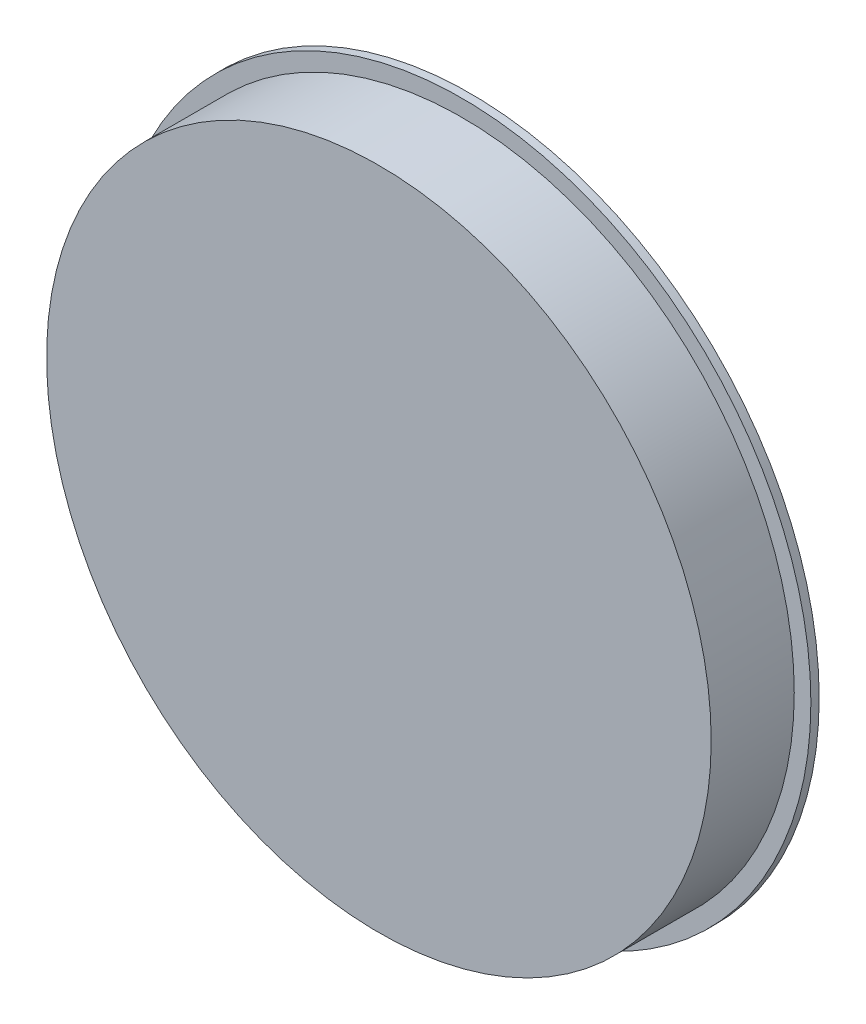
ISO-10303-21;
HEADER;
FILE_DESCRIPTION(('STEP AP214'),'2;1');
FILE_NAME('part.step','',(''),(''),'','','');
FILE_SCHEMA(('AUTOMOTIVE_DESIGN { 1 0 10303 214 1 1 1 1 }'));
ENDSEC;
DATA;
#1=APPLICATION_CONTEXT('core data for automotive mechanical design processes');
#2=APPLICATION_PROTOCOL_DEFINITION('international standard','automotive_design',2000,#1);
#3=PRODUCT_CONTEXT('',#1,'mechanical');
#4=PRODUCT('Part','Part','',(#3));
#5=PRODUCT_RELATED_PRODUCT_CATEGORY('part','',(#4));
#6=PRODUCT_DEFINITION_FORMATION('','',#4);
#7=PRODUCT_DEFINITION_CONTEXT('part definition',#1,'design');
#8=PRODUCT_DEFINITION('design','',#6,#7);
#9=PRODUCT_DEFINITION_SHAPE('','',#8);
#10=(LENGTH_UNIT() NAMED_UNIT(*) SI_UNIT(.MILLI.,.METRE.));
#11=(NAMED_UNIT(*) PLANE_ANGLE_UNIT() SI_UNIT($,.RADIAN.));
#12=(NAMED_UNIT(*) SI_UNIT($,.STERADIAN.) SOLID_ANGLE_UNIT());
#13=UNCERTAINTY_MEASURE_WITH_UNIT(LENGTH_MEASURE(1.E-05),#10,'distance_accuracy_value','');
#14=(GEOMETRIC_REPRESENTATION_CONTEXT(3) GLOBAL_UNCERTAINTY_ASSIGNED_CONTEXT((#13)) GLOBAL_UNIT_ASSIGNED_CONTEXT((#10,
#11,#12)) REPRESENTATION_CONTEXT('',''));
#15=CARTESIAN_POINT('',(0.,0.,0.));
#16=DIRECTION('',(0.,0.,1.));
#17=DIRECTION('',(1.,0.,0.));
#18=AXIS2_PLACEMENT_3D('',#15,#16,#17);
#19=CARTESIAN_POINT('',(0.,0.,-3.17499999999993));
#20=DIRECTION('',(0.,0.,-1.));
#21=DIRECTION('',(-1.,0.,0.));
#22=AXIS2_PLACEMENT_3D('',#19,#20,#21);
#23=PLANE('',#22);
#24=CARTESIAN_POINT('',(0.,0.,-3.17499999999993));
#25=DIRECTION('',(0.,0.,-1.));
#26=DIRECTION('',(-1.,0.,0.));
#27=AXIS2_PLACEMENT_3D('',#24,#25,#26);
#28=CIRCLE('',#27,12.5);
#29=CARTESIAN_POINT('',(-12.5,0.,-3.17499999999993));
#30=VERTEX_POINT('',#29);
#31=EDGE_CURVE('E42',#30,#30,#28,.F.);
#32=ORIENTED_EDGE('',*,*,#31,.F.);
#33=EDGE_LOOP('',(#32));
#34=FACE_BOUND('',#33,.T.);
#35=ADVANCED_FACE('F39',(#34),#23,.T.);
#36=CARTESIAN_POINT('',(0.,0.,-38.5303390593273));
#37=DIRECTION('',(0.,0.,1.));
#38=DIRECTION('',(1.,0.,0.));
#39=AXIS2_PLACEMENT_3D('',#36,#37,#38);
#40=CYLINDRICAL_SURFACE('',#39,12.5);
#41=CARTESIAN_POINT('',(0.,0.,0.));
#42=DIRECTION('',(0.,0.,1.));
#43=DIRECTION('',(1.,0.,0.));
#44=AXIS2_PLACEMENT_3D('',#41,#42,#43);
#45=CIRCLE('',#44,12.5);
#46=CARTESIAN_POINT('',(12.5,0.,0.));
#47=VERTEX_POINT('',#46);
#48=EDGE_CURVE('E50',#47,#47,#45,.T.);
#49=ORIENTED_EDGE('',*,*,#48,.F.);
#50=EDGE_LOOP('',(#49));
#51=FACE_BOUND('',#50,.T.);
#52=ORIENTED_EDGE('',*,*,#31,.T.);
#53=EDGE_LOOP('',(#52));
#54=FACE_BOUND('',#53,.T.);
#55=ADVANCED_FACE('F65',(#51,#54),#40,.T.);
#56=CARTESIAN_POINT('',(0.,0.,1.00000000000003));
#57=DIRECTION('',(0.,0.,-1.));
#58=DIRECTION('',(-1.,0.,0.));
#59=AXIS2_PLACEMENT_3D('',#56,#57,#58);
#60=CYLINDRICAL_SURFACE('',#59,42.);
#61=CARTESIAN_POINT('',(0.,0.,1.00000000000003));
#62=DIRECTION('',(0.,0.,1.));
#63=DIRECTION('',(1.,0.,0.));
#64=AXIS2_PLACEMENT_3D('',#61,#62,#63);
#65=CIRCLE('',#64,42.);
#66=CARTESIAN_POINT('',(42.,0.,1.00000000000003));
#67=VERTEX_POINT('',#66);
#68=EDGE_CURVE('E54',#67,#67,#65,.T.);
#69=ORIENTED_EDGE('',*,*,#68,.F.);
#70=EDGE_LOOP('',(#69));
#71=FACE_BOUND('',#70,.T.);
#72=CARTESIAN_POINT('',(0.,0.,0.));
#73=DIRECTION('',(0.,0.,1.));
#74=DIRECTION('',(1.,0.,0.));
#75=AXIS2_PLACEMENT_3D('',#72,#73,#74);
#76=CIRCLE('',#75,42.);
#77=CARTESIAN_POINT('',(42.,0.,0.));
#78=VERTEX_POINT('',#77);
#79=EDGE_CURVE('E57',#78,#78,#76,.T.);
#80=ORIENTED_EDGE('',*,*,#79,.T.);
#81=EDGE_LOOP('',(#80));
#82=FACE_BOUND('',#81,.T.);
#83=ADVANCED_FACE('F68',(#71,#82),#60,.T.);
#84=CARTESIAN_POINT('',(0.,0.,1.00000000000003));
#85=DIRECTION('',(0.,0.,1.));
#86=DIRECTION('',(1.,0.,0.));
#87=AXIS2_PLACEMENT_3D('',#84,#85,#86);
#88=PLANE('',#87);
#89=CARTESIAN_POINT('',(0.,0.,1.00000000000003));
#90=DIRECTION('',(0.,0.,1.));
#91=DIRECTION('',(1.,0.,0.));
#92=AXIS2_PLACEMENT_3D('',#89,#90,#91);
#93=CIRCLE('',#92,40.);
#94=CARTESIAN_POINT('',(40.,0.,1.00000000000003));
#95=VERTEX_POINT('',#94);
#96=EDGE_CURVE('E10',#95,#95,#93,.T.);
#97=ORIENTED_EDGE('',*,*,#96,.F.);
#98=EDGE_LOOP('',(#97));
#99=FACE_BOUND('',#98,.T.);
#100=ORIENTED_EDGE('',*,*,#68,.T.);
#101=EDGE_LOOP('',(#100));
#102=FACE_BOUND('',#101,.T.);
#103=ADVANCED_FACE('F86',(#99,#102),#88,.T.);
#104=CARTESIAN_POINT('',(0.,0.,0.));
#105=DIRECTION('',(0.,0.,1.));
#106=DIRECTION('',(1.,0.,0.));
#107=AXIS2_PLACEMENT_3D('',#104,#105,#106);
#108=PLANE('',#107);
#109=ORIENTED_EDGE('',*,*,#48,.T.);
#110=EDGE_LOOP('',(#109));
#111=FACE_BOUND('',#110,.T.);
#112=ORIENTED_EDGE('',*,*,#79,.F.);
#113=EDGE_LOOP('',(#112));
#114=FACE_BOUND('',#113,.T.);
#115=ADVANCED_FACE('F62',(#111,#114),#108,.F.);
#116=CARTESIAN_POINT('',(0.,0.,11.));
#117=DIRECTION('',(0.,0.,-1.));
#118=DIRECTION('',(-1.,0.,0.));
#119=AXIS2_PLACEMENT_3D('',#116,#117,#118);
#120=CYLINDRICAL_SURFACE('',#119,40.);
#121=CARTESIAN_POINT('',(0.,0.,11.));
#122=DIRECTION('',(0.,0.,1.));
#123=DIRECTION('',(1.,0.,0.));
#124=AXIS2_PLACEMENT_3D('',#121,#122,#123);
#125=CIRCLE('',#124,40.);
#126=CARTESIAN_POINT('',(40.,0.,11.));
#127=VERTEX_POINT('',#126);
#128=EDGE_CURVE('E53',#127,#127,#125,.T.);
#129=ORIENTED_EDGE('',*,*,#128,.F.);
#130=EDGE_LOOP('',(#129));
#131=FACE_BOUND('',#130,.T.);
#132=ORIENTED_EDGE('',*,*,#96,.T.);
#133=EDGE_LOOP('',(#132));
#134=FACE_BOUND('',#133,.T.);
#135=ADVANCED_FACE('F96',(#131,#134),#120,.T.);
#136=CARTESIAN_POINT('',(0.,0.,11.));
#137=DIRECTION('',(0.,0.,1.));
#138=DIRECTION('',(1.,0.,0.));
#139=AXIS2_PLACEMENT_3D('',#136,#137,#138);
#140=PLANE('',#139);
#141=ORIENTED_EDGE('',*,*,#128,.T.);
#142=EDGE_LOOP('',(#141));
#143=FACE_BOUND('',#142,.T.);
#144=ADVANCED_FACE('F111',(#143),#140,.T.);
#145=CLOSED_SHELL('',(#35,#55,#83,#103,#115,#135,#144));
#146=MANIFOLD_SOLID_BREP('B2',#145);
#147=ADVANCED_BREP_SHAPE_REPRESENTATION('',(#18,#146),#14);
#148=SHAPE_DEFINITION_REPRESENTATION(#9,#147);
ENDSEC;
END-ISO-10303-21;
